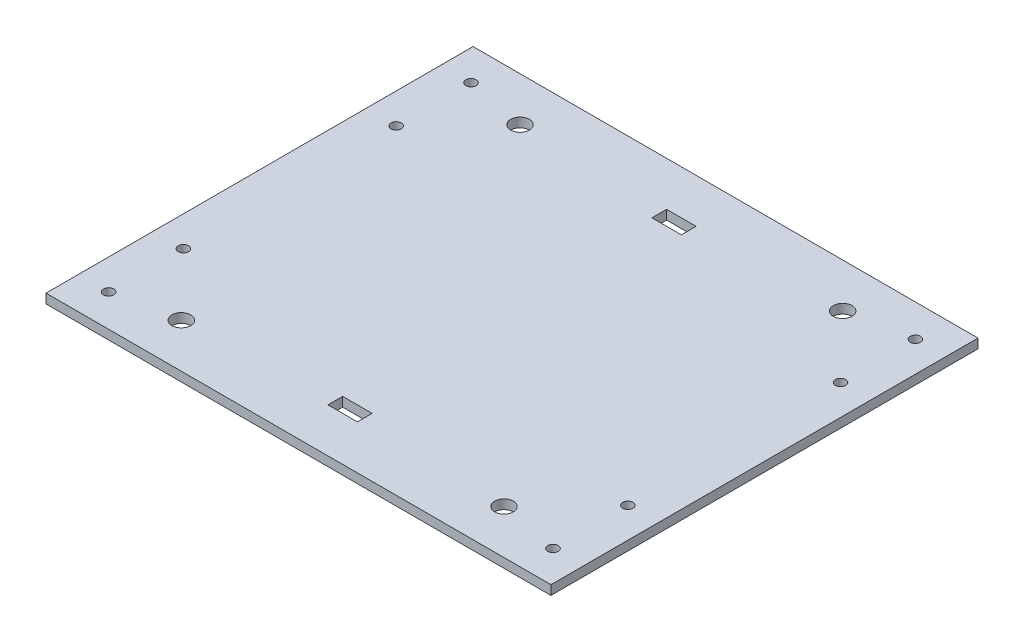
ISO-10303-21;
HEADER;
FILE_DESCRIPTION(('STEP AP214'),'2;1');
FILE_NAME('part.step','',(''),(''),'','','');
FILE_SCHEMA(('AUTOMOTIVE_DESIGN { 1 0 10303 214 1 1 1 1 }'));
ENDSEC;
DATA;
#1=APPLICATION_CONTEXT('core data for automotive mechanical design processes');
#2=APPLICATION_PROTOCOL_DEFINITION('international standard','automotive_design',2000,#1);
#3=PRODUCT_CONTEXT('',#1,'mechanical');
#4=PRODUCT('Part','Part','',(#3));
#5=PRODUCT_RELATED_PRODUCT_CATEGORY('part','',(#4));
#6=PRODUCT_DEFINITION_FORMATION('','',#4);
#7=PRODUCT_DEFINITION_CONTEXT('part definition',#1,'design');
#8=PRODUCT_DEFINITION('design','',#6,#7);
#9=PRODUCT_DEFINITION_SHAPE('','',#8);
#10=(LENGTH_UNIT() NAMED_UNIT(*) SI_UNIT(.MILLI.,.METRE.));
#11=(NAMED_UNIT(*) PLANE_ANGLE_UNIT() SI_UNIT($,.RADIAN.));
#12=(NAMED_UNIT(*) SI_UNIT($,.STERADIAN.) SOLID_ANGLE_UNIT());
#13=UNCERTAINTY_MEASURE_WITH_UNIT(LENGTH_MEASURE(1.E-05),#10,'distance_accuracy_value','');
#14=(GEOMETRIC_REPRESENTATION_CONTEXT(3) GLOBAL_UNCERTAINTY_ASSIGNED_CONTEXT((#13)) GLOBAL_UNIT_ASSIGNED_CONTEXT((#10,
#11,#12)) REPRESENTATION_CONTEXT('',''));
#15=CARTESIAN_POINT('',(0.,0.,0.));
#16=DIRECTION('',(0.,0.,1.));
#17=DIRECTION('',(1.,0.,0.));
#18=AXIS2_PLACEMENT_3D('',#15,#16,#17);
#19=CARTESIAN_POINT('',(0.,3.175,0.));
#20=DIRECTION('',(0.,1.,0.));
#21=DIRECTION('',(0.,0.,1.));
#22=AXIS2_PLACEMENT_3D('',#19,#20,#21);
#23=PLANE('',#22);
#24=CARTESIAN_POINT('',(145.213,3.175,-134.0145));
#25=DIRECTION('',(0.,-1.,0.));
#26=DIRECTION('',(0.,0.,-1.));
#27=AXIS2_PLACEMENT_3D('',#24,#25,#26);
#28=CIRCLE('',#27,1.75000000000001);
#29=CARTESIAN_POINT('',(145.213,3.175,-135.7645));
#30=VERTEX_POINT('',#29);
#31=EDGE_CURVE('E745',#30,#30,#28,.T.);
#32=ORIENTED_EDGE('',*,*,#31,.T.);
#33=EDGE_LOOP('',(#32));
#34=FACE_BOUND('',#33,.T.);
#35=CARTESIAN_POINT('',(145.213,3.175,-108.6145));
#36=DIRECTION('',(0.,-1.,0.));
#37=DIRECTION('',(0.,0.,-1.));
#38=AXIS2_PLACEMENT_3D('',#35,#36,#37);
#39=CIRCLE('',#38,1.75000000000001);
#40=CARTESIAN_POINT('',(145.213,3.175,-110.3645));
#41=VERTEX_POINT('',#40);
#42=EDGE_CURVE('E753',#41,#41,#39,.T.);
#43=ORIENTED_EDGE('',*,*,#42,.T.);
#44=EDGE_LOOP('',(#43));
#45=FACE_BOUND('',#44,.T.);
#46=CARTESIAN_POINT('',(145.213,3.175,-10.9855));
#47=DIRECTION('',(0.,1.,0.));
#48=DIRECTION('',(0.,0.,1.));
#49=AXIS2_PLACEMENT_3D('',#46,#47,#48);
#50=CIRCLE('',#49,1.75000000000001);
#51=CARTESIAN_POINT('',(145.213,3.175,-9.23549999999997));
#52=VERTEX_POINT('',#51);
#53=EDGE_CURVE('E765',#52,#52,#50,.T.);
#54=ORIENTED_EDGE('',*,*,#53,.F.);
#55=EDGE_LOOP('',(#54));
#56=FACE_BOUND('',#55,.T.);
#57=CARTESIAN_POINT('',(-5.66299999999999,3.175,-36.3855));
#58=DIRECTION('',(0.,-1.,0.));
#59=DIRECTION('',(0.,0.,-1.));
#60=AXIS2_PLACEMENT_3D('',#57,#58,#59);
#61=CIRCLE('',#60,1.75);
#62=CARTESIAN_POINT('',(-5.66299999999999,3.175,-38.1355));
#63=VERTEX_POINT('',#62);
#64=EDGE_CURVE('E771',#63,#63,#61,.T.);
#65=ORIENTED_EDGE('',*,*,#64,.T.);
#66=EDGE_LOOP('',(#65));
#67=FACE_BOUND('',#66,.T.);
#68=CARTESIAN_POINT('',(-5.663,3.175,-10.9855));
#69=DIRECTION('',(0.,-1.,0.));
#70=DIRECTION('',(0.,0.,-1.));
#71=AXIS2_PLACEMENT_3D('',#68,#69,#70);
#72=CIRCLE('',#71,1.75);
#73=CARTESIAN_POINT('',(-5.663,3.175,-12.7355));
#74=VERTEX_POINT('',#73);
#75=EDGE_CURVE('E777',#74,#74,#72,.T.);
#76=ORIENTED_EDGE('',*,*,#75,.T.);
#77=EDGE_LOOP('',(#76));
#78=FACE_BOUND('',#77,.T.);
#79=CARTESIAN_POINT('',(-5.66299999999999,3.175,-108.6145));
#80=DIRECTION('',(0.,1.,0.));
#81=DIRECTION('',(0.,0.,1.));
#82=AXIS2_PLACEMENT_3D('',#79,#80,#81);
#83=CIRCLE('',#82,1.75);
#84=CARTESIAN_POINT('',(-5.66299999999999,3.175,-106.8645));
#85=VERTEX_POINT('',#84);
#86=EDGE_CURVE('E789',#85,#85,#83,.T.);
#87=ORIENTED_EDGE('',*,*,#86,.F.);
#88=EDGE_LOOP('',(#87));
#89=FACE_BOUND('',#88,.T.);
#90=CARTESIAN_POINT('',(124.55,3.175,-15.));
#91=DIRECTION('',(0.,1.,0.));
#92=DIRECTION('',(0.,0.,1.));
#93=AXIS2_PLACEMENT_3D('',#90,#91,#92);
#94=CIRCLE('',#93,3.175);
#95=CARTESIAN_POINT('',(124.55,3.175,-11.825));
#96=VERTEX_POINT('',#95);
#97=EDGE_CURVE('E560',#96,#96,#94,.T.);
#98=ORIENTED_EDGE('',*,*,#97,.F.);
#99=EDGE_LOOP('',(#98));
#100=FACE_BOUND('',#99,.T.);
#101=CARTESIAN_POINT('',(124.55,3.175,-130.));
#102=DIRECTION('',(0.,-1.,0.));
#103=DIRECTION('',(0.,0.,-1.));
#104=AXIS2_PLACEMENT_3D('',#101,#102,#103);
#105=CIRCLE('',#104,3.175);
#106=CARTESIAN_POINT('',(124.55,3.175,-133.175));
#107=VERTEX_POINT('',#106);
#108=EDGE_CURVE('E566',#107,#107,#105,.T.);
#109=ORIENTED_EDGE('',*,*,#108,.T.);
#110=EDGE_LOOP('',(#109));
#111=FACE_BOUND('',#110,.T.);
#112=DIRECTION('',(-1.,0.,0.));
#113=VECTOR('',#112,1.);
#114=CARTESIAN_POINT('',(0.,3.175,-145.));
#115=LINE('',#114,#113);
#116=CARTESIAN_POINT('',(155.5,3.175,-145.));
#117=VERTEX_POINT('',#116);
#118=CARTESIAN_POINT('',(-15.95,3.175,-145.));
#119=VERTEX_POINT('',#118);
#120=EDGE_CURVE('E604',#117,#119,#115,.T.);
#121=ORIENTED_EDGE('',*,*,#120,.T.);
#122=DIRECTION('',(0.,0.,1.));
#123=VECTOR('',#122,1.);
#124=CARTESIAN_POINT('',(-15.95,3.175,-145.));
#125=LINE('',#124,#123);
#126=CARTESIAN_POINT('',(-15.95,3.175,0.));
#127=VERTEX_POINT('',#126);
#128=EDGE_CURVE('E607',#119,#127,#125,.T.);
#129=ORIENTED_EDGE('',*,*,#128,.T.);
#130=DIRECTION('',(-1.,0.,0.));
#131=VECTOR('',#130,1.);
#132=CARTESIAN_POINT('',(0.,3.175,0.));
#133=LINE('',#132,#131);
#134=CARTESIAN_POINT('',(155.5,3.175,0.));
#135=VERTEX_POINT('',#134);
#136=EDGE_CURVE('E610',#135,#127,#133,.T.);
#137=ORIENTED_EDGE('',*,*,#136,.F.);
#138=DIRECTION('',(0.,0.,1.));
#139=VECTOR('',#138,1.);
#140=CARTESIAN_POINT('',(155.5,3.175,-145.));
#141=LINE('',#140,#139);
#142=EDGE_CURVE('E613',#117,#135,#141,.T.);
#143=ORIENTED_EDGE('',*,*,#142,.F.);
#144=EDGE_LOOP('',(#121,#129,#137,#143));
#145=FACE_BOUND('',#144,.T.);
#146=DIRECTION('',(1.,0.,0.));
#147=VECTOR('',#146,1.);
#148=CARTESIAN_POINT('',(64.775,3.175,-125.));
#149=LINE('',#148,#147);
#150=CARTESIAN_POINT('',(64.775,3.175,-125.));
#151=VERTEX_POINT('',#150);
#152=CARTESIAN_POINT('',(74.775,3.175,-125.));
#153=VERTEX_POINT('',#152);
#154=EDGE_CURVE('E574',#151,#153,#149,.T.);
#155=ORIENTED_EDGE('',*,*,#154,.F.);
#156=DIRECTION('',(0.,0.,1.));
#157=VECTOR('',#156,1.);
#158=CARTESIAN_POINT('',(64.775,3.175,-130.));
#159=LINE('',#158,#157);
#160=CARTESIAN_POINT('',(64.775,3.175,-130.));
#161=VERTEX_POINT('',#160);
#162=EDGE_CURVE('E572',#161,#151,#159,.T.);
#163=ORIENTED_EDGE('',*,*,#162,.F.);
#164=DIRECTION('',(1.,0.,0.));
#165=VECTOR('',#164,1.);
#166=CARTESIAN_POINT('',(64.775,3.175,-130.));
#167=LINE('',#166,#165);
#168=CARTESIAN_POINT('',(74.775,3.175,-130.));
#169=VERTEX_POINT('',#168);
#170=EDGE_CURVE('E580',#161,#169,#167,.T.);
#171=ORIENTED_EDGE('',*,*,#170,.T.);
#172=DIRECTION('',(0.,0.,1.));
#173=VECTOR('',#172,1.);
#174=CARTESIAN_POINT('',(74.775,3.175,-130.));
#175=LINE('',#174,#173);
#176=EDGE_CURVE('E577',#169,#153,#175,.T.);
#177=ORIENTED_EDGE('',*,*,#176,.T.);
#178=EDGE_LOOP('',(#155,#163,#171,#177));
#179=FACE_BOUND('',#178,.T.);
#180=DIRECTION('',(0.,0.,-1.));
#181=VECTOR('',#180,1.);
#182=CARTESIAN_POINT('',(64.775,3.175,-15.));
#183=LINE('',#182,#181);
#184=CARTESIAN_POINT('',(64.775,3.175,-15.));
#185=VERTEX_POINT('',#184);
#186=CARTESIAN_POINT('',(64.775,3.175,-20.));
#187=VERTEX_POINT('',#186);
#188=EDGE_CURVE('E524',#185,#187,#183,.T.);
#189=ORIENTED_EDGE('',*,*,#188,.T.);
#190=DIRECTION('',(1.,0.,0.));
#191=VECTOR('',#190,1.);
#192=CARTESIAN_POINT('',(64.775,3.175,-20.));
#193=LINE('',#192,#191);
#194=CARTESIAN_POINT('',(74.775,3.175,-20.));
#195=VERTEX_POINT('',#194);
#196=EDGE_CURVE('E530',#187,#195,#193,.T.);
#197=ORIENTED_EDGE('',*,*,#196,.T.);
#198=DIRECTION('',(0.,0.,-1.));
#199=VECTOR('',#198,1.);
#200=CARTESIAN_POINT('',(74.775,3.175,-15.));
#201=LINE('',#200,#199);
#202=CARTESIAN_POINT('',(74.775,3.175,-15.));
#203=VERTEX_POINT('',#202);
#204=EDGE_CURVE('E534',#203,#195,#201,.T.);
#205=ORIENTED_EDGE('',*,*,#204,.F.);
#206=DIRECTION('',(1.,0.,0.));
#207=VECTOR('',#206,1.);
#208=CARTESIAN_POINT('',(64.775,3.175,-15.));
#209=LINE('',#208,#207);
#210=EDGE_CURVE('E527',#185,#203,#209,.T.);
#211=ORIENTED_EDGE('',*,*,#210,.F.);
#212=EDGE_LOOP('',(#189,#197,#205,#211));
#213=FACE_BOUND('',#212,.T.);
#214=CARTESIAN_POINT('',(15.,3.175,-15.));
#215=DIRECTION('',(0.,-1.,0.));
#216=DIRECTION('',(0.,0.,-1.));
#217=AXIS2_PLACEMENT_3D('',#214,#215,#216);
#218=CIRCLE('',#217,3.175);
#219=CARTESIAN_POINT('',(15.,3.175,-18.175));
#220=VERTEX_POINT('',#219);
#221=EDGE_CURVE('E550',#220,#220,#218,.T.);
#222=ORIENTED_EDGE('',*,*,#221,.T.);
#223=EDGE_LOOP('',(#222));
#224=FACE_BOUND('',#223,.T.);
#225=CARTESIAN_POINT('',(15.,3.175,-130.));
#226=DIRECTION('',(0.,1.,0.));
#227=DIRECTION('',(0.,0.,1.));
#228=AXIS2_PLACEMENT_3D('',#225,#226,#227);
#229=CIRCLE('',#228,3.175);
#230=CARTESIAN_POINT('',(15.,3.175,-126.825));
#231=VERTEX_POINT('',#230);
#232=EDGE_CURVE('E795',#231,#231,#229,.T.);
#233=ORIENTED_EDGE('',*,*,#232,.F.);
#234=EDGE_LOOP('',(#233));
#235=FACE_BOUND('',#234,.T.);
#236=CARTESIAN_POINT('',(-5.663,3.175,-134.0145));
#237=DIRECTION('',(0.,1.,0.));
#238=DIRECTION('',(0.,0.,1.));
#239=AXIS2_PLACEMENT_3D('',#236,#237,#238);
#240=CIRCLE('',#239,1.75);
#241=CARTESIAN_POINT('',(-5.663,3.175,-132.2645));
#242=VERTEX_POINT('',#241);
#243=EDGE_CURVE('E783',#242,#242,#240,.T.);
#244=ORIENTED_EDGE('',*,*,#243,.F.);
#245=EDGE_LOOP('',(#244));
#246=FACE_BOUND('',#245,.T.);
#247=CARTESIAN_POINT('',(145.213,3.175,-36.3855));
#248=DIRECTION('',(0.,1.,0.));
#249=DIRECTION('',(0.,0.,1.));
#250=AXIS2_PLACEMENT_3D('',#247,#248,#249);
#251=CIRCLE('',#250,1.75000000000001);
#252=CARTESIAN_POINT('',(145.213,3.175,-34.6355));
#253=VERTEX_POINT('',#252);
#254=EDGE_CURVE('E759',#253,#253,#251,.T.);
#255=ORIENTED_EDGE('',*,*,#254,.F.);
#256=EDGE_LOOP('',(#255));
#257=FACE_BOUND('',#256,.T.);
#258=ADVANCED_FACE('F433',(#34,#45,#56,#67,#78,#89,#100,#111,#145,#179,#213,#224,#235,#246,
#257),#23,.T.);
#259=CARTESIAN_POINT('',(0.,0.,0.));
#260=DIRECTION('',(0.,1.,0.));
#261=DIRECTION('',(0.,0.,1.));
#262=AXIS2_PLACEMENT_3D('',#259,#260,#261);
#263=PLANE('',#262);
#264=CARTESIAN_POINT('',(145.213,0.,-134.0145));
#265=DIRECTION('',(0.,-1.,0.));
#266=DIRECTION('',(0.,0.,-1.));
#267=AXIS2_PLACEMENT_3D('',#264,#265,#266);
#268=CIRCLE('',#267,1.75000000000001);
#269=CARTESIAN_POINT('',(145.213,0.,-135.7645));
#270=VERTEX_POINT('',#269);
#271=EDGE_CURVE('E748',#270,#270,#268,.T.);
#272=ORIENTED_EDGE('',*,*,#271,.F.);
#273=EDGE_LOOP('',(#272));
#274=FACE_BOUND('',#273,.T.);
#275=CARTESIAN_POINT('',(145.213,0.,-108.6145));
#276=DIRECTION('',(0.,-1.,0.));
#277=DIRECTION('',(0.,0.,-1.));
#278=AXIS2_PLACEMENT_3D('',#275,#276,#277);
#279=CIRCLE('',#278,1.75000000000001);
#280=CARTESIAN_POINT('',(145.213,0.,-110.3645));
#281=VERTEX_POINT('',#280);
#282=EDGE_CURVE('E750',#281,#281,#279,.T.);
#283=ORIENTED_EDGE('',*,*,#282,.F.);
#284=EDGE_LOOP('',(#283));
#285=FACE_BOUND('',#284,.T.);
#286=CARTESIAN_POINT('',(-5.66299999999999,0.,-36.3855));
#287=DIRECTION('',(0.,-1.,0.));
#288=DIRECTION('',(0.,0.,-1.));
#289=AXIS2_PLACEMENT_3D('',#286,#287,#288);
#290=CIRCLE('',#289,1.75);
#291=CARTESIAN_POINT('',(-5.66299999999999,0.,-38.1355));
#292=VERTEX_POINT('',#291);
#293=EDGE_CURVE('E768',#292,#292,#290,.T.);
#294=ORIENTED_EDGE('',*,*,#293,.F.);
#295=EDGE_LOOP('',(#294));
#296=FACE_BOUND('',#295,.T.);
#297=CARTESIAN_POINT('',(-5.663,0.,-10.9855));
#298=DIRECTION('',(0.,-1.,0.));
#299=DIRECTION('',(0.,0.,-1.));
#300=AXIS2_PLACEMENT_3D('',#297,#298,#299);
#301=CIRCLE('',#300,1.75);
#302=CARTESIAN_POINT('',(-5.663,0.,-12.7355));
#303=VERTEX_POINT('',#302);
#304=EDGE_CURVE('E774',#303,#303,#301,.T.);
#305=ORIENTED_EDGE('',*,*,#304,.F.);
#306=EDGE_LOOP('',(#305));
#307=FACE_BOUND('',#306,.T.);
#308=CARTESIAN_POINT('',(15.,0.,-15.));
#309=DIRECTION('',(0.,-1.,0.));
#310=DIRECTION('',(0.,0.,-1.));
#311=AXIS2_PLACEMENT_3D('',#308,#309,#310);
#312=CIRCLE('',#311,3.175);
#313=CARTESIAN_POINT('',(15.,0.,-18.175));
#314=VERTEX_POINT('',#313);
#315=EDGE_CURVE('E543',#314,#314,#312,.T.);
#316=ORIENTED_EDGE('',*,*,#315,.F.);
#317=EDGE_LOOP('',(#316));
#318=FACE_BOUND('',#317,.T.);
#319=DIRECTION('',(1.,0.,0.));
#320=VECTOR('',#319,1.);
#321=CARTESIAN_POINT('',(64.775,0.,-20.));
#322=LINE('',#321,#320);
#323=CARTESIAN_POINT('',(64.775,0.,-20.));
#324=VERTEX_POINT('',#323);
#325=CARTESIAN_POINT('',(74.775,0.,-20.));
#326=VERTEX_POINT('',#325);
#327=EDGE_CURVE('E549',#324,#326,#322,.T.);
#328=ORIENTED_EDGE('',*,*,#327,.F.);
#329=DIRECTION('',(0.,0.,-1.));
#330=VECTOR('',#329,1.);
#331=CARTESIAN_POINT('',(64.775,0.,-15.));
#332=LINE('',#331,#330);
#333=CARTESIAN_POINT('',(64.775,0.,-15.));
#334=VERTEX_POINT('',#333);
#335=EDGE_CURVE('E456',#334,#324,#332,.T.);
#336=ORIENTED_EDGE('',*,*,#335,.F.);
#337=DIRECTION('',(1.,0.,0.));
#338=VECTOR('',#337,1.);
#339=CARTESIAN_POINT('',(64.775,0.,-15.));
#340=LINE('',#339,#338);
#341=CARTESIAN_POINT('',(74.775,0.,-15.));
#342=VERTEX_POINT('',#341);
#343=EDGE_CURVE('E537',#334,#342,#340,.T.);
#344=ORIENTED_EDGE('',*,*,#343,.T.);
#345=DIRECTION('',(0.,0.,-1.));
#346=VECTOR('',#345,1.);
#347=CARTESIAN_POINT('',(74.775,0.,-15.));
#348=LINE('',#347,#346);
#349=EDGE_CURVE('E540',#342,#326,#348,.T.);
#350=ORIENTED_EDGE('',*,*,#349,.T.);
#351=EDGE_LOOP('',(#328,#336,#344,#350));
#352=FACE_BOUND('',#351,.T.);
#353=CARTESIAN_POINT('',(124.55,0.,-130.));
#354=DIRECTION('',(0.,-1.,0.));
#355=DIRECTION('',(0.,0.,-1.));
#356=AXIS2_PLACEMENT_3D('',#353,#354,#355);
#357=CIRCLE('',#356,3.175);
#358=CARTESIAN_POINT('',(124.55,0.,-133.175));
#359=VERTEX_POINT('',#358);
#360=EDGE_CURVE('E563',#359,#359,#357,.T.);
#361=ORIENTED_EDGE('',*,*,#360,.F.);
#362=EDGE_LOOP('',(#361));
#363=FACE_BOUND('',#362,.T.);
#364=DIRECTION('',(0.,0.,1.));
#365=VECTOR('',#364,1.);
#366=CARTESIAN_POINT('',(-15.95,0.,-145.));
#367=LINE('',#366,#365);
#368=CARTESIAN_POINT('',(-15.95,0.,-145.));
#369=VERTEX_POINT('',#368);
#370=CARTESIAN_POINT('',(-15.95,0.,0.));
#371=VERTEX_POINT('',#370);
#372=EDGE_CURVE('E603',#369,#371,#367,.T.);
#373=ORIENTED_EDGE('',*,*,#372,.F.);
#374=DIRECTION('',(1.,0.,0.));
#375=VECTOR('',#374,1.);
#376=CARTESIAN_POINT('',(0.,0.,-145.));
#377=LINE('',#376,#375);
#378=CARTESIAN_POINT('',(155.5,0.,-145.));
#379=VERTEX_POINT('',#378);
#380=EDGE_CURVE('E608',#369,#379,#377,.T.);
#381=ORIENTED_EDGE('',*,*,#380,.T.);
#382=DIRECTION('',(0.,0.,1.));
#383=VECTOR('',#382,1.);
#384=CARTESIAN_POINT('',(155.5,0.,-145.));
#385=LINE('',#384,#383);
#386=CARTESIAN_POINT('',(155.5,0.,0.));
#387=VERTEX_POINT('',#386);
#388=EDGE_CURVE('E622',#379,#387,#385,.T.);
#389=ORIENTED_EDGE('',*,*,#388,.T.);
#390=DIRECTION('',(1.,0.,0.));
#391=VECTOR('',#390,1.);
#392=CARTESIAN_POINT('',(139.55,0.,0.));
#393=LINE('',#392,#391);
#394=EDGE_CURVE('E619',#371,#387,#393,.T.);
#395=ORIENTED_EDGE('',*,*,#394,.F.);
#396=EDGE_LOOP('',(#373,#381,#389,#395));
#397=FACE_BOUND('',#396,.T.);
#398=DIRECTION('',(0.,0.,1.));
#399=VECTOR('',#398,1.);
#400=CARTESIAN_POINT('',(64.775,0.,-130.));
#401=LINE('',#400,#399);
#402=CARTESIAN_POINT('',(64.775,0.,-130.));
#403=VERTEX_POINT('',#402);
#404=CARTESIAN_POINT('',(64.775,0.,-125.));
#405=VERTEX_POINT('',#404);
#406=EDGE_CURVE('E569',#403,#405,#401,.T.);
#407=ORIENTED_EDGE('',*,*,#406,.T.);
#408=DIRECTION('',(1.,0.,0.));
#409=VECTOR('',#408,1.);
#410=CARTESIAN_POINT('',(64.775,0.,-125.));
#411=LINE('',#410,#409);
#412=CARTESIAN_POINT('',(74.775,0.,-125.));
#413=VERTEX_POINT('',#412);
#414=EDGE_CURVE('E586',#405,#413,#411,.T.);
#415=ORIENTED_EDGE('',*,*,#414,.T.);
#416=DIRECTION('',(0.,0.,1.));
#417=VECTOR('',#416,1.);
#418=CARTESIAN_POINT('',(74.775,0.,-130.));
#419=LINE('',#418,#417);
#420=CARTESIAN_POINT('',(74.775,0.,-130.));
#421=VERTEX_POINT('',#420);
#422=EDGE_CURVE('E589',#421,#413,#419,.T.);
#423=ORIENTED_EDGE('',*,*,#422,.F.);
#424=DIRECTION('',(1.,0.,0.));
#425=VECTOR('',#424,1.);
#426=CARTESIAN_POINT('',(64.775,0.,-130.));
#427=LINE('',#426,#425);
#428=EDGE_CURVE('E575',#403,#421,#427,.T.);
#429=ORIENTED_EDGE('',*,*,#428,.F.);
#430=EDGE_LOOP('',(#407,#415,#423,#429));
#431=FACE_BOUND('',#430,.T.);
#432=CARTESIAN_POINT('',(124.55,0.,-15.));
#433=DIRECTION('',(0.,1.,0.));
#434=DIRECTION('',(0.,0.,1.));
#435=AXIS2_PLACEMENT_3D('',#432,#433,#434);
#436=CIRCLE('',#435,3.175);
#437=CARTESIAN_POINT('',(124.55,0.,-11.825));
#438=VERTEX_POINT('',#437);
#439=EDGE_CURVE('E556',#438,#438,#436,.T.);
#440=ORIENTED_EDGE('',*,*,#439,.T.);
#441=EDGE_LOOP('',(#440));
#442=FACE_BOUND('',#441,.T.);
#443=CARTESIAN_POINT('',(15.,0.,-130.));
#444=DIRECTION('',(0.,1.,0.));
#445=DIRECTION('',(0.,0.,1.));
#446=AXIS2_PLACEMENT_3D('',#443,#444,#445);
#447=CIRCLE('',#446,3.175);
#448=CARTESIAN_POINT('',(15.,0.,-126.825));
#449=VERTEX_POINT('',#448);
#450=EDGE_CURVE('E792',#449,#449,#447,.T.);
#451=ORIENTED_EDGE('',*,*,#450,.T.);
#452=EDGE_LOOP('',(#451));
#453=FACE_BOUND('',#452,.T.);
#454=CARTESIAN_POINT('',(-5.66299999999999,0.,-108.6145));
#455=DIRECTION('',(0.,1.,0.));
#456=DIRECTION('',(0.,0.,1.));
#457=AXIS2_PLACEMENT_3D('',#454,#455,#456);
#458=CIRCLE('',#457,1.75);
#459=CARTESIAN_POINT('',(-5.66299999999999,0.,-106.8645));
#460=VERTEX_POINT('',#459);
#461=EDGE_CURVE('E786',#460,#460,#458,.T.);
#462=ORIENTED_EDGE('',*,*,#461,.T.);
#463=EDGE_LOOP('',(#462));
#464=FACE_BOUND('',#463,.T.);
#465=CARTESIAN_POINT('',(-5.663,0.,-134.0145));
#466=DIRECTION('',(0.,1.,0.));
#467=DIRECTION('',(0.,0.,1.));
#468=AXIS2_PLACEMENT_3D('',#465,#466,#467);
#469=CIRCLE('',#468,1.75);
#470=CARTESIAN_POINT('',(-5.663,0.,-132.2645));
#471=VERTEX_POINT('',#470);
#472=EDGE_CURVE('E780',#471,#471,#469,.T.);
#473=ORIENTED_EDGE('',*,*,#472,.T.);
#474=EDGE_LOOP('',(#473));
#475=FACE_BOUND('',#474,.T.);
#476=CARTESIAN_POINT('',(145.213,0.,-10.9855));
#477=DIRECTION('',(0.,1.,0.));
#478=DIRECTION('',(0.,0.,1.));
#479=AXIS2_PLACEMENT_3D('',#476,#477,#478);
#480=CIRCLE('',#479,1.75000000000001);
#481=CARTESIAN_POINT('',(145.213,0.,-9.23549999999997));
#482=VERTEX_POINT('',#481);
#483=EDGE_CURVE('E762',#482,#482,#480,.T.);
#484=ORIENTED_EDGE('',*,*,#483,.T.);
#485=EDGE_LOOP('',(#484));
#486=FACE_BOUND('',#485,.T.);
#487=CARTESIAN_POINT('',(145.213,0.,-36.3855));
#488=DIRECTION('',(0.,1.,0.));
#489=DIRECTION('',(0.,0.,1.));
#490=AXIS2_PLACEMENT_3D('',#487,#488,#489);
#491=CIRCLE('',#490,1.75000000000001);
#492=CARTESIAN_POINT('',(145.213,0.,-34.6355));
#493=VERTEX_POINT('',#492);
#494=EDGE_CURVE('E756',#493,#493,#491,.T.);
#495=ORIENTED_EDGE('',*,*,#494,.T.);
#496=EDGE_LOOP('',(#495));
#497=FACE_BOUND('',#496,.T.);
#498=ADVANCED_FACE('F638',(#274,#285,#296,#307,#318,#352,#363,#397,#431,#442,#453,#464,#475,
#486,#497),#263,.F.);
#499=CARTESIAN_POINT('',(-15.95,3.175,-145.));
#500=DIRECTION('',(1.,0.,0.));
#501=DIRECTION('',(0.,0.,-1.));
#502=AXIS2_PLACEMENT_3D('',#499,#500,#501);
#503=PLANE('',#502);
#504=ORIENTED_EDGE('',*,*,#372,.T.);
#505=DIRECTION('',(0.,-1.,0.));
#506=VECTOR('',#505,1.);
#507=CARTESIAN_POINT('',(-15.95,3.175,0.));
#508=LINE('',#507,#506);
#509=EDGE_CURVE('E441',#127,#371,#508,.T.);
#510=ORIENTED_EDGE('',*,*,#509,.F.);
#511=ORIENTED_EDGE('',*,*,#128,.F.);
#512=DIRECTION('',(0.,-1.,0.));
#513=VECTOR('',#512,1.);
#514=CARTESIAN_POINT('',(-15.95,3.175,-145.));
#515=LINE('',#514,#513);
#516=EDGE_CURVE('E12',#119,#369,#515,.T.);
#517=ORIENTED_EDGE('',*,*,#516,.T.);
#518=EDGE_LOOP('',(#504,#510,#511,#517));
#519=FACE_BOUND('',#518,.T.);
#520=ADVANCED_FACE('F435',(#519),#503,.F.);
#521=CARTESIAN_POINT('',(139.55,3.175,0.));
#522=DIRECTION('',(0.,0.,-1.));
#523=DIRECTION('',(-1.,0.,0.));
#524=AXIS2_PLACEMENT_3D('',#521,#522,#523);
#525=PLANE('',#524);
#526=ORIENTED_EDGE('',*,*,#394,.T.);
#527=DIRECTION('',(0.,-1.,0.));
#528=VECTOR('',#527,1.);
#529=CARTESIAN_POINT('',(155.5,3.175,0.));
#530=LINE('',#529,#528);
#531=EDGE_CURVE('E628',#135,#387,#530,.T.);
#532=ORIENTED_EDGE('',*,*,#531,.F.);
#533=ORIENTED_EDGE('',*,*,#136,.T.);
#534=ORIENTED_EDGE('',*,*,#509,.T.);
#535=EDGE_LOOP('',(#526,#532,#533,#534));
#536=FACE_BOUND('',#535,.T.);
#537=ADVANCED_FACE('F632',(#536),#525,.F.);
#538=CARTESIAN_POINT('',(155.5,3.175,-145.));
#539=DIRECTION('',(1.,0.,0.));
#540=DIRECTION('',(0.,0.,-1.));
#541=AXIS2_PLACEMENT_3D('',#538,#539,#540);
#542=PLANE('',#541);
#543=ORIENTED_EDGE('',*,*,#388,.F.);
#544=DIRECTION('',(0.,-1.,0.));
#545=VECTOR('',#544,1.);
#546=CARTESIAN_POINT('',(155.5,3.175,-145.));
#547=LINE('',#546,#545);
#548=EDGE_CURVE('E616',#117,#379,#547,.T.);
#549=ORIENTED_EDGE('',*,*,#548,.F.);
#550=ORIENTED_EDGE('',*,*,#142,.T.);
#551=ORIENTED_EDGE('',*,*,#531,.T.);
#552=EDGE_LOOP('',(#543,#549,#550,#551));
#553=FACE_BOUND('',#552,.T.);
#554=ADVANCED_FACE('F643',(#553),#542,.T.);
#555=CARTESIAN_POINT('',(0.,3.175,-145.));
#556=DIRECTION('',(0.,0.,-1.));
#557=DIRECTION('',(-1.,0.,0.));
#558=AXIS2_PLACEMENT_3D('',#555,#556,#557);
#559=PLANE('',#558);
#560=ORIENTED_EDGE('',*,*,#380,.F.);
#561=ORIENTED_EDGE('',*,*,#516,.F.);
#562=ORIENTED_EDGE('',*,*,#120,.F.);
#563=ORIENTED_EDGE('',*,*,#548,.T.);
#564=EDGE_LOOP('',(#560,#561,#562,#563));
#565=FACE_BOUND('',#564,.T.);
#566=ADVANCED_FACE('F648',(#565),#559,.T.);
#567=CARTESIAN_POINT('',(64.775,3.175,-130.));
#568=DIRECTION('',(1.,0.,0.));
#569=DIRECTION('',(0.,0.,-1.));
#570=AXIS2_PLACEMENT_3D('',#567,#568,#569);
#571=PLANE('',#570);
#572=ORIENTED_EDGE('',*,*,#406,.F.);
#573=DIRECTION('',(0.,-1.,0.));
#574=VECTOR('',#573,1.);
#575=CARTESIAN_POINT('',(64.775,3.175,-130.));
#576=LINE('',#575,#574);
#577=EDGE_CURVE('E583',#161,#403,#576,.T.);
#578=ORIENTED_EDGE('',*,*,#577,.F.);
#579=ORIENTED_EDGE('',*,*,#162,.T.);
#580=DIRECTION('',(0.,-1.,0.));
#581=VECTOR('',#580,1.);
#582=CARTESIAN_POINT('',(64.775,3.175,-125.));
#583=LINE('',#582,#581);
#584=EDGE_CURVE('E600',#151,#405,#583,.T.);
#585=ORIENTED_EDGE('',*,*,#584,.T.);
#586=EDGE_LOOP('',(#572,#578,#579,#585));
#587=FACE_BOUND('',#586,.T.);
#588=ADVANCED_FACE('F650',(#587),#571,.T.);
#589=CARTESIAN_POINT('',(64.775,3.175,-125.));
#590=DIRECTION('',(0.,0.,-1.));
#591=DIRECTION('',(-1.,0.,0.));
#592=AXIS2_PLACEMENT_3D('',#589,#590,#591);
#593=PLANE('',#592);
#594=ORIENTED_EDGE('',*,*,#414,.F.);
#595=ORIENTED_EDGE('',*,*,#584,.F.);
#596=ORIENTED_EDGE('',*,*,#154,.T.);
#597=DIRECTION('',(0.,-1.,0.));
#598=VECTOR('',#597,1.);
#599=CARTESIAN_POINT('',(74.775,3.175,-125.));
#600=LINE('',#599,#598);
#601=EDGE_CURVE('E598',#153,#413,#600,.T.);
#602=ORIENTED_EDGE('',*,*,#601,.T.);
#603=EDGE_LOOP('',(#594,#595,#596,#602));
#604=FACE_BOUND('',#603,.T.);
#605=ADVANCED_FACE('F656',(#604),#593,.T.);
#606=CARTESIAN_POINT('',(74.775,3.175,-130.));
#607=DIRECTION('',(1.,0.,0.));
#608=DIRECTION('',(0.,0.,-1.));
#609=AXIS2_PLACEMENT_3D('',#606,#607,#608);
#610=PLANE('',#609);
#611=ORIENTED_EDGE('',*,*,#422,.T.);
#612=ORIENTED_EDGE('',*,*,#601,.F.);
#613=ORIENTED_EDGE('',*,*,#176,.F.);
#614=DIRECTION('',(0.,-1.,0.));
#615=VECTOR('',#614,1.);
#616=CARTESIAN_POINT('',(74.775,3.175,-130.));
#617=LINE('',#616,#615);
#618=EDGE_CURVE('E596',#169,#421,#617,.T.);
#619=ORIENTED_EDGE('',*,*,#618,.T.);
#620=EDGE_LOOP('',(#611,#612,#613,#619));
#621=FACE_BOUND('',#620,.T.);
#622=ADVANCED_FACE('F673',(#621),#610,.F.);
#623=CARTESIAN_POINT('',(64.775,3.175,-130.));
#624=DIRECTION('',(0.,0.,-1.));
#625=DIRECTION('',(-1.,0.,0.));
#626=AXIS2_PLACEMENT_3D('',#623,#624,#625);
#627=PLANE('',#626);
#628=ORIENTED_EDGE('',*,*,#428,.T.);
#629=ORIENTED_EDGE('',*,*,#618,.F.);
#630=ORIENTED_EDGE('',*,*,#170,.F.);
#631=ORIENTED_EDGE('',*,*,#577,.T.);
#632=EDGE_LOOP('',(#628,#629,#630,#631));
#633=FACE_BOUND('',#632,.T.);
#634=ADVANCED_FACE('F677',(#633),#627,.F.);
#635=CARTESIAN_POINT('',(124.55,3.175,-130.));
#636=DIRECTION('',(0.,-1.,0.));
#637=DIRECTION('',(0.,0.,-1.));
#638=AXIS2_PLACEMENT_3D('',#635,#636,#637);
#639=CYLINDRICAL_SURFACE('',#638,3.175);
#640=ORIENTED_EDGE('',*,*,#108,.F.);
#641=EDGE_LOOP('',(#640));
#642=FACE_BOUND('',#641,.T.);
#643=ORIENTED_EDGE('',*,*,#360,.T.);
#644=EDGE_LOOP('',(#643));
#645=FACE_BOUND('',#644,.T.);
#646=ADVANCED_FACE('F681',(#642,#645),#639,.F.);
#647=CARTESIAN_POINT('',(124.55,3.175,-15.));
#648=DIRECTION('',(0.,-1.,0.));
#649=DIRECTION('',(0.,0.,-1.));
#650=AXIS2_PLACEMENT_3D('',#647,#648,#649);
#651=CYLINDRICAL_SURFACE('',#650,3.175);
#652=ORIENTED_EDGE('',*,*,#97,.T.);
#653=EDGE_LOOP('',(#652));
#654=FACE_BOUND('',#653,.T.);
#655=ORIENTED_EDGE('',*,*,#439,.F.);
#656=EDGE_LOOP('',(#655));
#657=FACE_BOUND('',#656,.T.);
#658=ADVANCED_FACE('F685',(#654,#657),#651,.F.);
#659=CARTESIAN_POINT('',(64.775,3.175,-15.));
#660=DIRECTION('',(-1.,0.,0.));
#661=DIRECTION('',(0.,0.,1.));
#662=AXIS2_PLACEMENT_3D('',#659,#660,#661);
#663=PLANE('',#662);
#664=ORIENTED_EDGE('',*,*,#335,.T.);
#665=DIRECTION('',(0.,-1.,0.));
#666=VECTOR('',#665,1.);
#667=CARTESIAN_POINT('',(64.775,3.175,-20.));
#668=LINE('',#667,#666);
#669=EDGE_CURVE('E521',#187,#324,#668,.T.);
#670=ORIENTED_EDGE('',*,*,#669,.F.);
#671=ORIENTED_EDGE('',*,*,#188,.F.);
#672=DIRECTION('',(0.,-1.,0.));
#673=VECTOR('',#672,1.);
#674=CARTESIAN_POINT('',(64.775,3.175,-15.));
#675=LINE('',#674,#673);
#676=EDGE_CURVE('E554',#185,#334,#675,.T.);
#677=ORIENTED_EDGE('',*,*,#676,.T.);
#678=EDGE_LOOP('',(#664,#670,#671,#677));
#679=FACE_BOUND('',#678,.T.);
#680=ADVANCED_FACE('F522',(#679),#663,.F.);
#681=CARTESIAN_POINT('',(64.775,3.175,-15.));
#682=DIRECTION('',(0.,0.,-1.));
#683=DIRECTION('',(-1.,0.,0.));
#684=AXIS2_PLACEMENT_3D('',#681,#682,#683);
#685=PLANE('',#684);
#686=ORIENTED_EDGE('',*,*,#343,.F.);
#687=ORIENTED_EDGE('',*,*,#676,.F.);
#688=ORIENTED_EDGE('',*,*,#210,.T.);
#689=DIRECTION('',(0.,-1.,0.));
#690=VECTOR('',#689,1.);
#691=CARTESIAN_POINT('',(74.775,3.175,-15.));
#692=LINE('',#691,#690);
#693=EDGE_CURVE('E557',#203,#342,#692,.T.);
#694=ORIENTED_EDGE('',*,*,#693,.T.);
#695=EDGE_LOOP('',(#686,#687,#688,#694));
#696=FACE_BOUND('',#695,.T.);
#697=ADVANCED_FACE('F692',(#696),#685,.T.);
#698=CARTESIAN_POINT('',(74.775,3.175,-15.));
#699=DIRECTION('',(-1.,0.,0.));
#700=DIRECTION('',(0.,0.,1.));
#701=AXIS2_PLACEMENT_3D('',#698,#699,#700);
#702=PLANE('',#701);
#703=ORIENTED_EDGE('',*,*,#349,.F.);
#704=ORIENTED_EDGE('',*,*,#693,.F.);
#705=ORIENTED_EDGE('',*,*,#204,.T.);
#706=DIRECTION('',(0.,-1.,0.));
#707=VECTOR('',#706,1.);
#708=CARTESIAN_POINT('',(74.775,3.175,-20.));
#709=LINE('',#708,#707);
#710=EDGE_CURVE('E448',#195,#326,#709,.T.);
#711=ORIENTED_EDGE('',*,*,#710,.T.);
#712=EDGE_LOOP('',(#703,#704,#705,#711));
#713=FACE_BOUND('',#712,.T.);
#714=ADVANCED_FACE('F696',(#713),#702,.T.);
#715=CARTESIAN_POINT('',(64.775,3.175,-20.));
#716=DIRECTION('',(0.,0.,-1.));
#717=DIRECTION('',(-1.,0.,0.));
#718=AXIS2_PLACEMENT_3D('',#715,#716,#717);
#719=PLANE('',#718);
#720=ORIENTED_EDGE('',*,*,#327,.T.);
#721=ORIENTED_EDGE('',*,*,#710,.F.);
#722=ORIENTED_EDGE('',*,*,#196,.F.);
#723=ORIENTED_EDGE('',*,*,#669,.T.);
#724=EDGE_LOOP('',(#720,#721,#722,#723));
#725=FACE_BOUND('',#724,.T.);
#726=ADVANCED_FACE('F531',(#725),#719,.F.);
#727=CARTESIAN_POINT('',(15.,3.175,-15.));
#728=DIRECTION('',(0.,-1.,0.));
#729=DIRECTION('',(0.,0.,-1.));
#730=AXIS2_PLACEMENT_3D('',#727,#728,#729);
#731=CYLINDRICAL_SURFACE('',#730,3.175);
#732=ORIENTED_EDGE('',*,*,#221,.F.);
#733=EDGE_LOOP('',(#732));
#734=FACE_BOUND('',#733,.T.);
#735=ORIENTED_EDGE('',*,*,#315,.T.);
#736=EDGE_LOOP('',(#735));
#737=FACE_BOUND('',#736,.T.);
#738=ADVANCED_FACE('F695',(#734,#737),#731,.F.);
#739=CARTESIAN_POINT('',(15.,3.175,-130.));
#740=DIRECTION('',(0.,-1.,0.));
#741=DIRECTION('',(0.,0.,-1.));
#742=AXIS2_PLACEMENT_3D('',#739,#740,#741);
#743=CYLINDRICAL_SURFACE('',#742,3.175);
#744=ORIENTED_EDGE('',*,*,#232,.T.);
#745=EDGE_LOOP('',(#744));
#746=FACE_BOUND('',#745,.T.);
#747=ORIENTED_EDGE('',*,*,#450,.F.);
#748=EDGE_LOOP('',(#747));
#749=FACE_BOUND('',#748,.T.);
#750=ADVANCED_FACE('F705',(#746,#749),#743,.F.);
#751=CARTESIAN_POINT('',(-5.66299999999999,3.175,-108.6145));
#752=DIRECTION('',(0.,-1.,0.));
#753=DIRECTION('',(0.,0.,-1.));
#754=AXIS2_PLACEMENT_3D('',#751,#752,#753);
#755=CYLINDRICAL_SURFACE('',#754,1.75);
#756=ORIENTED_EDGE('',*,*,#86,.T.);
#757=EDGE_LOOP('',(#756));
#758=FACE_BOUND('',#757,.T.);
#759=ORIENTED_EDGE('',*,*,#461,.F.);
#760=EDGE_LOOP('',(#759));
#761=FACE_BOUND('',#760,.T.);
#762=ADVANCED_FACE('F709',(#758,#761),#755,.F.);
#763=CARTESIAN_POINT('',(-5.663,3.175,-134.0145));
#764=DIRECTION('',(0.,-1.,0.));
#765=DIRECTION('',(0.,0.,-1.));
#766=AXIS2_PLACEMENT_3D('',#763,#764,#765);
#767=CYLINDRICAL_SURFACE('',#766,1.75);
#768=ORIENTED_EDGE('',*,*,#243,.T.);
#769=EDGE_LOOP('',(#768));
#770=FACE_BOUND('',#769,.T.);
#771=ORIENTED_EDGE('',*,*,#472,.F.);
#772=EDGE_LOOP('',(#771));
#773=FACE_BOUND('',#772,.T.);
#774=ADVANCED_FACE('F713',(#770,#773),#767,.F.);
#775=CARTESIAN_POINT('',(-5.663,3.175,-10.9855));
#776=DIRECTION('',(0.,-1.,0.));
#777=DIRECTION('',(0.,0.,-1.));
#778=AXIS2_PLACEMENT_3D('',#775,#776,#777);
#779=CYLINDRICAL_SURFACE('',#778,1.75);
#780=ORIENTED_EDGE('',*,*,#75,.F.);
#781=EDGE_LOOP('',(#780));
#782=FACE_BOUND('',#781,.T.);
#783=ORIENTED_EDGE('',*,*,#304,.T.);
#784=EDGE_LOOP('',(#783));
#785=FACE_BOUND('',#784,.T.);
#786=ADVANCED_FACE('F717',(#782,#785),#779,.F.);
#787=CARTESIAN_POINT('',(-5.66299999999999,3.175,-36.3855));
#788=DIRECTION('',(0.,-1.,0.));
#789=DIRECTION('',(0.,0.,-1.));
#790=AXIS2_PLACEMENT_3D('',#787,#788,#789);
#791=CYLINDRICAL_SURFACE('',#790,1.75);
#792=ORIENTED_EDGE('',*,*,#64,.F.);
#793=EDGE_LOOP('',(#792));
#794=FACE_BOUND('',#793,.T.);
#795=ORIENTED_EDGE('',*,*,#293,.T.);
#796=EDGE_LOOP('',(#795));
#797=FACE_BOUND('',#796,.T.);
#798=ADVANCED_FACE('F721',(#794,#797),#791,.F.);
#799=CARTESIAN_POINT('',(145.213,3.175,-10.9855));
#800=DIRECTION('',(0.,-1.,0.));
#801=DIRECTION('',(0.,0.,-1.));
#802=AXIS2_PLACEMENT_3D('',#799,#800,#801);
#803=CYLINDRICAL_SURFACE('',#802,1.75000000000001);
#804=ORIENTED_EDGE('',*,*,#53,.T.);
#805=EDGE_LOOP('',(#804));
#806=FACE_BOUND('',#805,.T.);
#807=ORIENTED_EDGE('',*,*,#483,.F.);
#808=EDGE_LOOP('',(#807));
#809=FACE_BOUND('',#808,.T.);
#810=ADVANCED_FACE('F725',(#806,#809),#803,.F.);
#811=CARTESIAN_POINT('',(145.213,3.175,-36.3855));
#812=DIRECTION('',(0.,-1.,0.));
#813=DIRECTION('',(0.,0.,-1.));
#814=AXIS2_PLACEMENT_3D('',#811,#812,#813);
#815=CYLINDRICAL_SURFACE('',#814,1.75000000000001);
#816=ORIENTED_EDGE('',*,*,#254,.T.);
#817=EDGE_LOOP('',(#816));
#818=FACE_BOUND('',#817,.T.);
#819=ORIENTED_EDGE('',*,*,#494,.F.);
#820=EDGE_LOOP('',(#819));
#821=FACE_BOUND('',#820,.T.);
#822=ADVANCED_FACE('F729',(#818,#821),#815,.F.);
#823=CARTESIAN_POINT('',(145.213,3.175,-108.6145));
#824=DIRECTION('',(0.,-1.,0.));
#825=DIRECTION('',(0.,0.,-1.));
#826=AXIS2_PLACEMENT_3D('',#823,#824,#825);
#827=CYLINDRICAL_SURFACE('',#826,1.75000000000001);
#828=ORIENTED_EDGE('',*,*,#42,.F.);
#829=EDGE_LOOP('',(#828));
#830=FACE_BOUND('',#829,.T.);
#831=ORIENTED_EDGE('',*,*,#282,.T.);
#832=EDGE_LOOP('',(#831));
#833=FACE_BOUND('',#832,.T.);
#834=ADVANCED_FACE('F733',(#830,#833),#827,.F.);
#835=CARTESIAN_POINT('',(145.213,3.175,-134.0145));
#836=DIRECTION('',(0.,-1.,0.));
#837=DIRECTION('',(0.,0.,-1.));
#838=AXIS2_PLACEMENT_3D('',#835,#836,#837);
#839=CYLINDRICAL_SURFACE('',#838,1.75000000000001);
#840=ORIENTED_EDGE('',*,*,#31,.F.);
#841=EDGE_LOOP('',(#840));
#842=FACE_BOUND('',#841,.T.);
#843=ORIENTED_EDGE('',*,*,#271,.T.);
#844=EDGE_LOOP('',(#843));
#845=FACE_BOUND('',#844,.T.);
#846=ADVANCED_FACE('F737',(#842,#845),#839,.F.);
#847=CLOSED_SHELL('',(#258,#498,#520,#537,#554,#566,#588,#605,#622,#634,#646,#658,#680,#697,
#714,#726,#738,#750,#762,#774,#786,#798,#810,#822,#834,#846));
#848=MANIFOLD_SOLID_BREP('B2',#847);
#849=ADVANCED_BREP_SHAPE_REPRESENTATION('',(#18,#848),#14);
#850=SHAPE_DEFINITION_REPRESENTATION(#9,#849);
ENDSEC;
END-ISO-10303-21;
